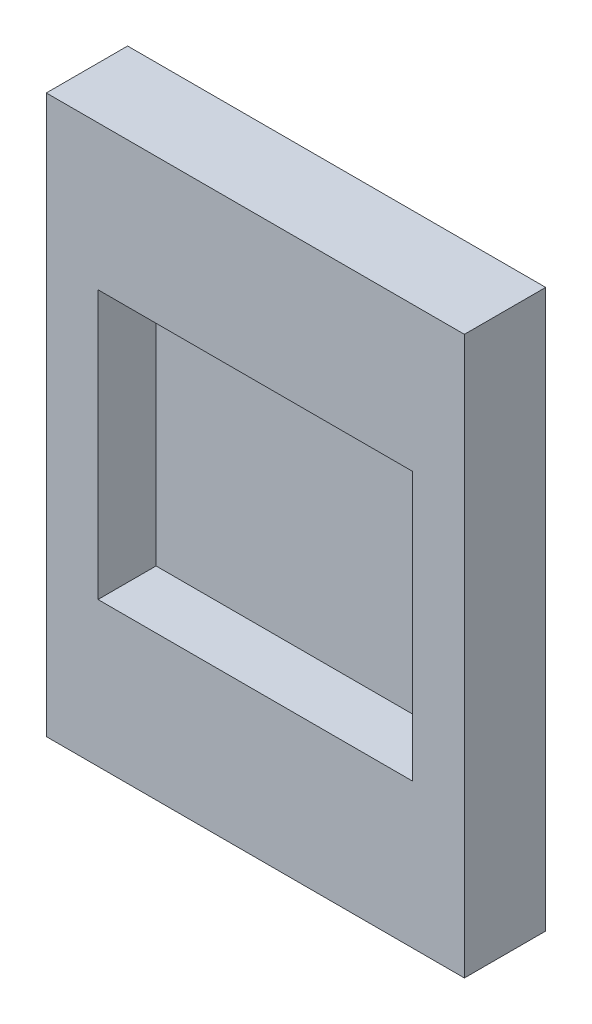
ISO-10303-21;
HEADER;
FILE_DESCRIPTION(('STEP AP214'),'2;1');
FILE_NAME('part.step','',(''),(''),'','','');
FILE_SCHEMA(('AUTOMOTIVE_DESIGN { 1 0 10303 214 1 1 1 1 }'));
ENDSEC;
DATA;
#1=APPLICATION_CONTEXT('core data for automotive mechanical design processes');
#2=APPLICATION_PROTOCOL_DEFINITION('international standard','automotive_design',2000,#1);
#3=PRODUCT_CONTEXT('',#1,'mechanical');
#4=PRODUCT('Part','Part','',(#3));
#5=PRODUCT_RELATED_PRODUCT_CATEGORY('part','',(#4));
#6=PRODUCT_DEFINITION_FORMATION('','',#4);
#7=PRODUCT_DEFINITION_CONTEXT('part definition',#1,'design');
#8=PRODUCT_DEFINITION('design','',#6,#7);
#9=PRODUCT_DEFINITION_SHAPE('','',#8);
#10=(LENGTH_UNIT() NAMED_UNIT(*) SI_UNIT(.MILLI.,.METRE.));
#11=(NAMED_UNIT(*) PLANE_ANGLE_UNIT() SI_UNIT($,.RADIAN.));
#12=(NAMED_UNIT(*) SI_UNIT($,.STERADIAN.) SOLID_ANGLE_UNIT());
#13=UNCERTAINTY_MEASURE_WITH_UNIT(LENGTH_MEASURE(1.E-05),#10,'distance_accuracy_value','');
#14=(GEOMETRIC_REPRESENTATION_CONTEXT(3) GLOBAL_UNCERTAINTY_ASSIGNED_CONTEXT((#13)) GLOBAL_UNIT_ASSIGNED_CONTEXT((#10,
#11,#12)) REPRESENTATION_CONTEXT('',''));
#15=CARTESIAN_POINT('',(0.,0.,0.));
#16=DIRECTION('',(0.,0.,1.));
#17=DIRECTION('',(1.,0.,0.));
#18=AXIS2_PLACEMENT_3D('',#15,#16,#17);
#19=CARTESIAN_POINT('',(9.,-12.,3.5));
#20=DIRECTION('',(-1.,0.,0.));
#21=DIRECTION('',(0.,0.,1.));
#22=AXIS2_PLACEMENT_3D('',#19,#20,#21);
#23=PLANE('',#22);
#24=DIRECTION('',(0.,1.,0.));
#25=VECTOR('',#24,1.);
#26=CARTESIAN_POINT('',(9.,-12.,0.));
#27=LINE('',#26,#25);
#28=CARTESIAN_POINT('',(9.,-12.,0.));
#29=VERTEX_POINT('',#28);
#30=CARTESIAN_POINT('',(9.,12.,0.));
#31=VERTEX_POINT('',#30);
#32=EDGE_CURVE('E145',#29,#31,#27,.T.);
#33=ORIENTED_EDGE('',*,*,#32,.T.);
#34=DIRECTION('',(0.,0.,-1.));
#35=VECTOR('',#34,1.);
#36=CARTESIAN_POINT('',(9.,12.,3.5));
#37=LINE('',#36,#35);
#38=CARTESIAN_POINT('',(9.,12.,3.5));
#39=VERTEX_POINT('',#38);
#40=EDGE_CURVE('E11',#39,#31,#37,.T.);
#41=ORIENTED_EDGE('',*,*,#40,.F.);
#42=DIRECTION('',(0.,1.,0.));
#43=VECTOR('',#42,1.);
#44=CARTESIAN_POINT('',(9.,-12.,3.5));
#45=LINE('',#44,#43);
#46=CARTESIAN_POINT('',(9.,-12.,3.5));
#47=VERTEX_POINT('',#46);
#48=EDGE_CURVE('E149',#47,#39,#45,.T.);
#49=ORIENTED_EDGE('',*,*,#48,.F.);
#50=DIRECTION('',(0.,0.,-1.));
#51=VECTOR('',#50,1.);
#52=CARTESIAN_POINT('',(9.,-12.,3.5));
#53=LINE('',#52,#51);
#54=EDGE_CURVE('E155',#47,#29,#53,.T.);
#55=ORIENTED_EDGE('',*,*,#54,.T.);
#56=EDGE_LOOP('',(#33,#41,#49,#55));
#57=FACE_BOUND('',#56,.T.);
#58=ADVANCED_FACE('F37',(#57),#23,.F.);
#59=CARTESIAN_POINT('',(-9.,12.,3.5));
#60=DIRECTION('',(0.,-1.,0.));
#61=DIRECTION('',(0.,0.,-1.));
#62=AXIS2_PLACEMENT_3D('',#59,#60,#61);
#63=PLANE('',#62);
#64=DIRECTION('',(-1.,0.,0.));
#65=VECTOR('',#64,1.);
#66=CARTESIAN_POINT('',(-9.,12.,0.));
#67=LINE('',#66,#65);
#68=CARTESIAN_POINT('',(-9.,12.,0.));
#69=VERTEX_POINT('',#68);
#70=EDGE_CURVE('E158',#31,#69,#67,.T.);
#71=ORIENTED_EDGE('',*,*,#70,.T.);
#72=DIRECTION('',(0.,0.,-1.));
#73=VECTOR('',#72,1.);
#74=CARTESIAN_POINT('',(-9.,12.,3.5));
#75=LINE('',#74,#73);
#76=CARTESIAN_POINT('',(-9.,12.,3.5));
#77=VERTEX_POINT('',#76);
#78=EDGE_CURVE('E44',#77,#69,#75,.T.);
#79=ORIENTED_EDGE('',*,*,#78,.F.);
#80=DIRECTION('',(-1.,0.,0.));
#81=VECTOR('',#80,1.);
#82=CARTESIAN_POINT('',(-9.,12.,3.5));
#83=LINE('',#82,#81);
#84=EDGE_CURVE('E88',#39,#77,#83,.T.);
#85=ORIENTED_EDGE('',*,*,#84,.F.);
#86=ORIENTED_EDGE('',*,*,#40,.T.);
#87=EDGE_LOOP('',(#71,#79,#85,#86));
#88=FACE_BOUND('',#87,.T.);
#89=ADVANCED_FACE('F187',(#88),#63,.F.);
#90=CARTESIAN_POINT('',(-9.,-12.,3.5));
#91=DIRECTION('',(1.,0.,0.));
#92=DIRECTION('',(0.,0.,-1.));
#93=AXIS2_PLACEMENT_3D('',#90,#91,#92);
#94=PLANE('',#93);
#95=DIRECTION('',(0.,-1.,0.));
#96=VECTOR('',#95,1.);
#97=CARTESIAN_POINT('',(-9.,-12.,0.));
#98=LINE('',#97,#96);
#99=CARTESIAN_POINT('',(-9.,-12.,0.));
#100=VERTEX_POINT('',#99);
#101=EDGE_CURVE('E160',#69,#100,#98,.T.);
#102=ORIENTED_EDGE('',*,*,#101,.T.);
#103=DIRECTION('',(0.,0.,-1.));
#104=VECTOR('',#103,1.);
#105=CARTESIAN_POINT('',(-9.,-12.,3.5));
#106=LINE('',#105,#104);
#107=CARTESIAN_POINT('',(-9.,-12.,3.5));
#108=VERTEX_POINT('',#107);
#109=EDGE_CURVE('E164',#108,#100,#106,.T.);
#110=ORIENTED_EDGE('',*,*,#109,.F.);
#111=DIRECTION('',(0.,-1.,0.));
#112=VECTOR('',#111,1.);
#113=CARTESIAN_POINT('',(-9.,-12.,3.5));
#114=LINE('',#113,#112);
#115=EDGE_CURVE('E152',#77,#108,#114,.T.);
#116=ORIENTED_EDGE('',*,*,#115,.F.);
#117=ORIENTED_EDGE('',*,*,#78,.T.);
#118=EDGE_LOOP('',(#102,#110,#116,#117));
#119=FACE_BOUND('',#118,.T.);
#120=ADVANCED_FACE('F169',(#119),#94,.F.);
#121=CARTESIAN_POINT('',(-9.,-12.,3.5));
#122=DIRECTION('',(0.,1.,0.));
#123=DIRECTION('',(0.,0.,1.));
#124=AXIS2_PLACEMENT_3D('',#121,#122,#123);
#125=PLANE('',#124);
#126=DIRECTION('',(1.,0.,0.));
#127=VECTOR('',#126,1.);
#128=CARTESIAN_POINT('',(-9.,-12.,0.));
#129=LINE('',#128,#127);
#130=EDGE_CURVE('E81',#100,#29,#129,.T.);
#131=ORIENTED_EDGE('',*,*,#130,.T.);
#132=ORIENTED_EDGE('',*,*,#54,.F.);
#133=DIRECTION('',(1.,0.,0.));
#134=VECTOR('',#133,1.);
#135=CARTESIAN_POINT('',(-9.,-12.,3.5));
#136=LINE('',#135,#134);
#137=EDGE_CURVE('E60',#108,#47,#136,.T.);
#138=ORIENTED_EDGE('',*,*,#137,.F.);
#139=ORIENTED_EDGE('',*,*,#109,.T.);
#140=EDGE_LOOP('',(#131,#132,#138,#139));
#141=FACE_BOUND('',#140,.T.);
#142=ADVANCED_FACE('F177',(#141),#125,.F.);
#143=CARTESIAN_POINT('',(0.,0.,3.5));
#144=DIRECTION('',(0.,0.,-1.));
#145=DIRECTION('',(-1.,0.,0.));
#146=AXIS2_PLACEMENT_3D('',#143,#144,#145);
#147=PLANE('',#146);
#148=DIRECTION('',(-1.,0.,0.));
#149=VECTOR('',#148,1.);
#150=CARTESIAN_POINT('',(-6.775,5.775,3.5));
#151=LINE('',#150,#149);
#152=CARTESIAN_POINT('',(6.775,5.775,3.5));
#153=VERTEX_POINT('',#152);
#154=CARTESIAN_POINT('',(-6.775,5.775,3.5));
#155=VERTEX_POINT('',#154);
#156=EDGE_CURVE('E139',#153,#155,#151,.T.);
#157=ORIENTED_EDGE('',*,*,#156,.F.);
#158=DIRECTION('',(0.,1.,0.));
#159=VECTOR('',#158,1.);
#160=CARTESIAN_POINT('',(6.775,-5.775,3.5));
#161=LINE('',#160,#159);
#162=CARTESIAN_POINT('',(6.775,-5.775,3.5));
#163=VERTEX_POINT('',#162);
#164=EDGE_CURVE('E51',#163,#153,#161,.T.);
#165=ORIENTED_EDGE('',*,*,#164,.F.);
#166=DIRECTION('',(1.,0.,0.));
#167=VECTOR('',#166,1.);
#168=CARTESIAN_POINT('',(-6.775,-5.775,3.5));
#169=LINE('',#168,#167);
#170=CARTESIAN_POINT('',(-6.775,-5.775,3.5));
#171=VERTEX_POINT('',#170);
#172=EDGE_CURVE('E130',#171,#163,#169,.T.);
#173=ORIENTED_EDGE('',*,*,#172,.F.);
#174=DIRECTION('',(0.,-1.,0.));
#175=VECTOR('',#174,1.);
#176=CARTESIAN_POINT('',(-6.775,-5.775,3.5));
#177=LINE('',#176,#175);
#178=EDGE_CURVE('E133',#155,#171,#177,.T.);
#179=ORIENTED_EDGE('',*,*,#178,.F.);
#180=EDGE_LOOP('',(#157,#165,#173,#179));
#181=FACE_BOUND('',#180,.T.);
#182=ORIENTED_EDGE('',*,*,#48,.T.);
#183=ORIENTED_EDGE('',*,*,#84,.T.);
#184=ORIENTED_EDGE('',*,*,#115,.T.);
#185=ORIENTED_EDGE('',*,*,#137,.T.);
#186=EDGE_LOOP('',(#182,#183,#184,#185));
#187=FACE_BOUND('',#186,.T.);
#188=ADVANCED_FACE('F179',(#181,#187),#147,.F.);
#189=CARTESIAN_POINT('',(0.,0.,0.));
#190=DIRECTION('',(0.,0.,-1.));
#191=DIRECTION('',(-1.,0.,0.));
#192=AXIS2_PLACEMENT_3D('',#189,#190,#191);
#193=PLANE('',#192);
#194=ORIENTED_EDGE('',*,*,#32,.F.);
#195=ORIENTED_EDGE('',*,*,#130,.F.);
#196=ORIENTED_EDGE('',*,*,#101,.F.);
#197=ORIENTED_EDGE('',*,*,#70,.F.);
#198=EDGE_LOOP('',(#194,#195,#196,#197));
#199=FACE_BOUND('',#198,.T.);
#200=ADVANCED_FACE('F173',(#199),#193,.T.);
#201=CARTESIAN_POINT('',(6.775,-5.775,1.));
#202=DIRECTION('',(1.,0.,0.));
#203=DIRECTION('',(0.,0.,-1.));
#204=AXIS2_PLACEMENT_3D('',#201,#202,#203);
#205=PLANE('',#204);
#206=ORIENTED_EDGE('',*,*,#164,.T.);
#207=DIRECTION('',(0.,0.,1.));
#208=VECTOR('',#207,1.);
#209=CARTESIAN_POINT('',(6.775,5.775,1.));
#210=LINE('',#209,#208);
#211=CARTESIAN_POINT('',(6.775,5.775,1.));
#212=VERTEX_POINT('',#211);
#213=EDGE_CURVE('E108',#212,#153,#210,.T.);
#214=ORIENTED_EDGE('',*,*,#213,.F.);
#215=DIRECTION('',(0.,1.,0.));
#216=VECTOR('',#215,1.);
#217=CARTESIAN_POINT('',(6.775,-5.775,1.));
#218=LINE('',#217,#216);
#219=CARTESIAN_POINT('',(6.775,-5.775,1.));
#220=VERTEX_POINT('',#219);
#221=EDGE_CURVE('E112',#220,#212,#218,.T.);
#222=ORIENTED_EDGE('',*,*,#221,.F.);
#223=DIRECTION('',(0.,0.,1.));
#224=VECTOR('',#223,1.);
#225=CARTESIAN_POINT('',(6.775,-5.775,1.));
#226=LINE('',#225,#224);
#227=EDGE_CURVE('E143',#220,#163,#226,.T.);
#228=ORIENTED_EDGE('',*,*,#227,.T.);
#229=EDGE_LOOP('',(#206,#214,#222,#228));
#230=FACE_BOUND('',#229,.T.);
#231=ADVANCED_FACE('F110',(#230),#205,.F.);
#232=CARTESIAN_POINT('',(-6.775,-5.775,1.));
#233=DIRECTION('',(0.,-1.,0.));
#234=DIRECTION('',(0.,0.,-1.));
#235=AXIS2_PLACEMENT_3D('',#232,#233,#234);
#236=PLANE('',#235);
#237=ORIENTED_EDGE('',*,*,#172,.T.);
#238=ORIENTED_EDGE('',*,*,#227,.F.);
#239=DIRECTION('',(1.,0.,0.));
#240=VECTOR('',#239,1.);
#241=CARTESIAN_POINT('',(-6.775,-5.775,1.));
#242=LINE('',#241,#240);
#243=CARTESIAN_POINT('',(-6.775,-5.775,1.));
#244=VERTEX_POINT('',#243);
#245=EDGE_CURVE('E118',#244,#220,#242,.T.);
#246=ORIENTED_EDGE('',*,*,#245,.F.);
#247=DIRECTION('',(0.,0.,1.));
#248=VECTOR('',#247,1.);
#249=CARTESIAN_POINT('',(-6.775,-5.775,1.));
#250=LINE('',#249,#248);
#251=EDGE_CURVE('E146',#244,#171,#250,.T.);
#252=ORIENTED_EDGE('',*,*,#251,.T.);
#253=EDGE_LOOP('',(#237,#238,#246,#252));
#254=FACE_BOUND('',#253,.T.);
#255=ADVANCED_FACE('F226',(#254),#236,.F.);
#256=CARTESIAN_POINT('',(-6.775,-5.775,1.));
#257=DIRECTION('',(-1.,0.,0.));
#258=DIRECTION('',(0.,0.,1.));
#259=AXIS2_PLACEMENT_3D('',#256,#257,#258);
#260=PLANE('',#259);
#261=ORIENTED_EDGE('',*,*,#178,.T.);
#262=ORIENTED_EDGE('',*,*,#251,.F.);
#263=DIRECTION('',(0.,-1.,0.));
#264=VECTOR('',#263,1.);
#265=CARTESIAN_POINT('',(-6.775,-5.775,1.));
#266=LINE('',#265,#264);
#267=CARTESIAN_POINT('',(-6.775,5.775,1.));
#268=VERTEX_POINT('',#267);
#269=EDGE_CURVE('E126',#268,#244,#266,.T.);
#270=ORIENTED_EDGE('',*,*,#269,.F.);
#271=DIRECTION('',(0.,0.,1.));
#272=VECTOR('',#271,1.);
#273=CARTESIAN_POINT('',(-6.775,5.775,1.));
#274=LINE('',#273,#272);
#275=EDGE_CURVE('E117',#268,#155,#274,.T.);
#276=ORIENTED_EDGE('',*,*,#275,.T.);
#277=EDGE_LOOP('',(#261,#262,#270,#276));
#278=FACE_BOUND('',#277,.T.);
#279=ADVANCED_FACE('F235',(#278),#260,.F.);
#280=CARTESIAN_POINT('',(-6.775,5.775,1.));
#281=DIRECTION('',(0.,1.,0.));
#282=DIRECTION('',(0.,0.,1.));
#283=AXIS2_PLACEMENT_3D('',#280,#281,#282);
#284=PLANE('',#283);
#285=ORIENTED_EDGE('',*,*,#156,.T.);
#286=ORIENTED_EDGE('',*,*,#275,.F.);
#287=DIRECTION('',(-1.,0.,0.));
#288=VECTOR('',#287,1.);
#289=CARTESIAN_POINT('',(-6.775,5.775,1.));
#290=LINE('',#289,#288);
#291=EDGE_CURVE('E121',#212,#268,#290,.T.);
#292=ORIENTED_EDGE('',*,*,#291,.F.);
#293=ORIENTED_EDGE('',*,*,#213,.T.);
#294=EDGE_LOOP('',(#285,#286,#292,#293));
#295=FACE_BOUND('',#294,.T.);
#296=ADVANCED_FACE('F122',(#295),#284,.F.);
#297=CARTESIAN_POINT('',(0.,0.,1.));
#298=DIRECTION('',(0.,0.,-1.));
#299=DIRECTION('',(-1.,0.,0.));
#300=AXIS2_PLACEMENT_3D('',#297,#298,#299);
#301=PLANE('',#300);
#302=ORIENTED_EDGE('',*,*,#221,.T.);
#303=ORIENTED_EDGE('',*,*,#291,.T.);
#304=ORIENTED_EDGE('',*,*,#269,.T.);
#305=ORIENTED_EDGE('',*,*,#245,.T.);
#306=EDGE_LOOP('',(#302,#303,#304,#305));
#307=FACE_BOUND('',#306,.T.);
#308=ADVANCED_FACE('F128',(#307),#301,.F.);
#309=CLOSED_SHELL('',(#58,#89,#120,#142,#188,#200,#231,#255,#279,#296,#308));
#310=MANIFOLD_SOLID_BREP('B2',#309);
#311=ADVANCED_BREP_SHAPE_REPRESENTATION('',(#18,#310),#14);
#312=SHAPE_DEFINITION_REPRESENTATION(#9,#311);
ENDSEC;
END-ISO-10303-21;
